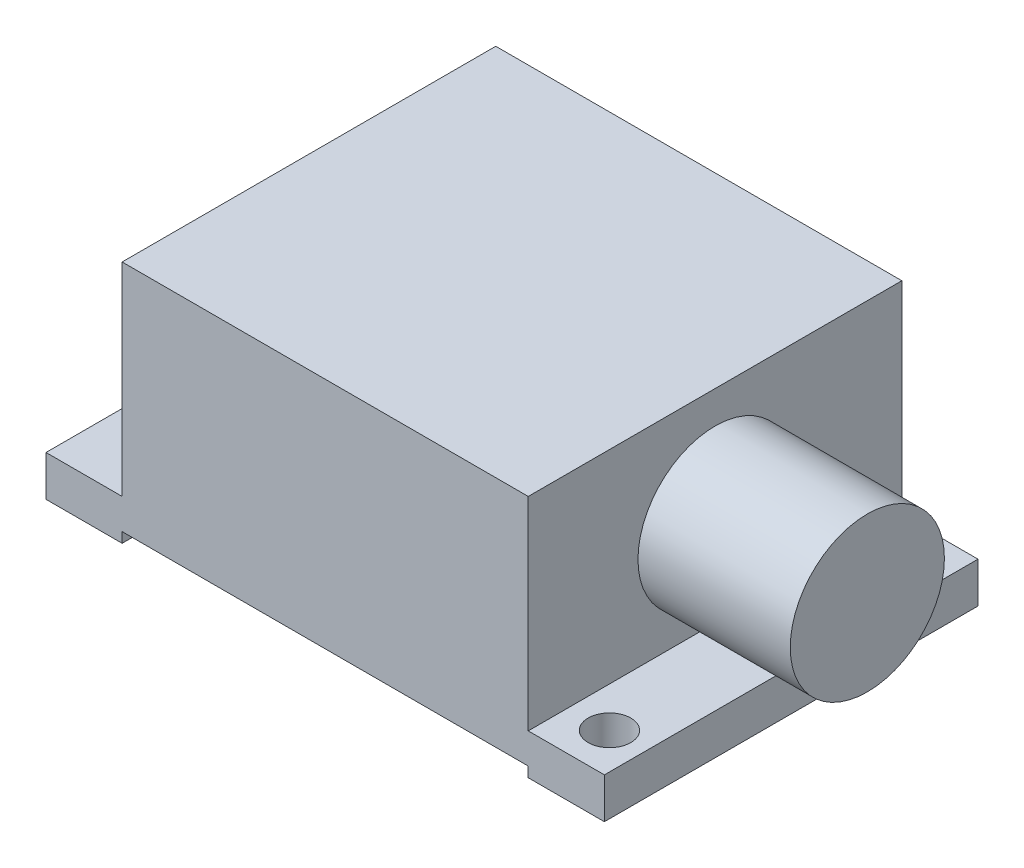
ISO-10303-21;
HEADER;
FILE_DESCRIPTION(('STEP AP214'),'2;1');
FILE_NAME('part.step','',(''),(''),'','','');
FILE_SCHEMA(('AUTOMOTIVE_DESIGN { 1 0 10303 214 1 1 1 1 }'));
ENDSEC;
DATA;
#1=APPLICATION_CONTEXT('core data for automotive mechanical design processes');
#2=APPLICATION_PROTOCOL_DEFINITION('international standard','automotive_design',2000,#1);
#3=PRODUCT_CONTEXT('',#1,'mechanical');
#4=PRODUCT('Part','Part','',(#3));
#5=PRODUCT_RELATED_PRODUCT_CATEGORY('part','',(#4));
#6=PRODUCT_DEFINITION_FORMATION('','',#4);
#7=PRODUCT_DEFINITION_CONTEXT('part definition',#1,'design');
#8=PRODUCT_DEFINITION('design','',#6,#7);
#9=PRODUCT_DEFINITION_SHAPE('','',#8);
#10=(LENGTH_UNIT() NAMED_UNIT(*) SI_UNIT(.MILLI.,.METRE.));
#11=(NAMED_UNIT(*) PLANE_ANGLE_UNIT() SI_UNIT($,.RADIAN.));
#12=(NAMED_UNIT(*) SI_UNIT($,.STERADIAN.) SOLID_ANGLE_UNIT());
#13=UNCERTAINTY_MEASURE_WITH_UNIT(LENGTH_MEASURE(1.E-05),#10,'distance_accuracy_value','');
#14=(GEOMETRIC_REPRESENTATION_CONTEXT(3) GLOBAL_UNCERTAINTY_ASSIGNED_CONTEXT((#13)) GLOBAL_UNIT_ASSIGNED_CONTEXT((#10,
#11,#12)) REPRESENTATION_CONTEXT('',''));
#15=CARTESIAN_POINT('',(0.,0.,0.));
#16=DIRECTION('',(0.,0.,1.));
#17=DIRECTION('',(1.,0.,0.));
#18=AXIS2_PLACEMENT_3D('',#15,#16,#17);
#19=CARTESIAN_POINT('',(0.,0.,0.));
#20=DIRECTION('',(0.,1.,0.));
#21=DIRECTION('',(0.,0.,1.));
#22=AXIS2_PLACEMENT_3D('',#19,#20,#21);
#23=PLANE('',#22);
#24=CARTESIAN_POINT('',(23.95,0.,-14.35));
#25=DIRECTION('',(0.,1.,0.));
#26=DIRECTION('',(0.,0.,1.));
#27=AXIS2_PLACEMENT_3D('',#24,#25,#26);
#28=CIRCLE('',#27,2.1);
#29=CARTESIAN_POINT('',(23.95,0.,-12.25));
#30=VERTEX_POINT('',#29);
#31=EDGE_CURVE('E142',#30,#30,#28,.T.);
#32=ORIENTED_EDGE('',*,*,#31,.T.);
#33=EDGE_LOOP('',(#32));
#34=FACE_BOUND('',#33,.T.);
#35=CARTESIAN_POINT('',(23.95,0.,14.35));
#36=DIRECTION('',(0.,1.,0.));
#37=DIRECTION('',(0.,0.,1.));
#38=AXIS2_PLACEMENT_3D('',#35,#36,#37);
#39=CIRCLE('',#38,2.1);
#40=CARTESIAN_POINT('',(23.95,0.,16.45));
#41=VERTEX_POINT('',#40);
#42=EDGE_CURVE('E221',#41,#41,#39,.T.);
#43=ORIENTED_EDGE('',*,*,#42,.T.);
#44=EDGE_LOOP('',(#43));
#45=FACE_BOUND('',#44,.T.);
#46=DIRECTION('',(1.,0.,0.));
#47=VECTOR('',#46,1.);
#48=CARTESIAN_POINT('',(-27.5,0.,18.4));
#49=LINE('',#48,#47);
#50=CARTESIAN_POINT('',(20.,0.,18.4));
#51=VERTEX_POINT('',#50);
#52=CARTESIAN_POINT('',(27.5,0.,18.4));
#53=VERTEX_POINT('',#52);
#54=EDGE_CURVE('E204',#51,#53,#49,.T.);
#55=ORIENTED_EDGE('',*,*,#54,.F.);
#56=DIRECTION('',(0.,0.,-1.));
#57=VECTOR('',#56,1.);
#58=CARTESIAN_POINT('',(20.,0.,0.));
#59=LINE('',#58,#57);
#60=CARTESIAN_POINT('',(20.,0.,-18.4));
#61=VERTEX_POINT('',#60);
#62=EDGE_CURVE('E43',#51,#61,#59,.T.);
#63=ORIENTED_EDGE('',*,*,#62,.T.);
#64=DIRECTION('',(-1.,0.,0.));
#65=VECTOR('',#64,1.);
#66=CARTESIAN_POINT('',(-27.5,0.,-18.4));
#67=LINE('',#66,#65);
#68=CARTESIAN_POINT('',(27.5,0.,-18.4));
#69=VERTEX_POINT('',#68);
#70=EDGE_CURVE('E199',#69,#61,#67,.T.);
#71=ORIENTED_EDGE('',*,*,#70,.F.);
#72=DIRECTION('',(0.,0.,-1.));
#73=VECTOR('',#72,1.);
#74=CARTESIAN_POINT('',(27.5,0.,-18.4));
#75=LINE('',#74,#73);
#76=EDGE_CURVE('E182',#53,#69,#75,.T.);
#77=ORIENTED_EDGE('',*,*,#76,.F.);
#78=EDGE_LOOP('',(#55,#63,#71,#77));
#79=FACE_BOUND('',#78,.T.);
#80=ADVANCED_FACE('F35',(#34,#45,#79),#23,.F.);
#81=CARTESIAN_POINT('',(0.,4.,0.));
#82=DIRECTION('',(0.,1.,0.));
#83=DIRECTION('',(0.,0.,1.));
#84=AXIS2_PLACEMENT_3D('',#81,#82,#83);
#85=PLANE('',#84);
#86=CARTESIAN_POINT('',(23.95,4.,-14.35));
#87=DIRECTION('',(0.,1.,0.));
#88=DIRECTION('',(0.,0.,1.));
#89=AXIS2_PLACEMENT_3D('',#86,#87,#88);
#90=CIRCLE('',#89,2.1);
#91=CARTESIAN_POINT('',(23.95,4.,-12.25));
#92=VERTEX_POINT('',#91);
#93=EDGE_CURVE('E228',#92,#92,#90,.T.);
#94=ORIENTED_EDGE('',*,*,#93,.F.);
#95=EDGE_LOOP('',(#94));
#96=FACE_BOUND('',#95,.T.);
#97=CARTESIAN_POINT('',(23.95,4.,14.35));
#98=DIRECTION('',(0.,1.,0.));
#99=DIRECTION('',(0.,0.,1.));
#100=AXIS2_PLACEMENT_3D('',#97,#98,#99);
#101=CIRCLE('',#100,2.1);
#102=CARTESIAN_POINT('',(23.95,4.,16.45));
#103=VERTEX_POINT('',#102);
#104=EDGE_CURVE('E233',#103,#103,#101,.T.);
#105=ORIENTED_EDGE('',*,*,#104,.F.);
#106=EDGE_LOOP('',(#105));
#107=FACE_BOUND('',#106,.T.);
#108=DIRECTION('',(0.,0.,-1.));
#109=VECTOR('',#108,1.);
#110=CARTESIAN_POINT('',(20.,4.,-18.4));
#111=LINE('',#110,#109);
#112=CARTESIAN_POINT('',(20.,4.,18.4));
#113=VERTEX_POINT('',#112);
#114=CARTESIAN_POINT('',(20.,4.,-18.4));
#115=VERTEX_POINT('',#114);
#116=EDGE_CURVE('E58',#113,#115,#111,.T.);
#117=ORIENTED_EDGE('',*,*,#116,.F.);
#118=DIRECTION('',(1.,0.,0.));
#119=VECTOR('',#118,1.);
#120=CARTESIAN_POINT('',(-27.5,4.,18.4));
#121=LINE('',#120,#119);
#122=CARTESIAN_POINT('',(27.5,4.,18.4));
#123=VERTEX_POINT('',#122);
#124=EDGE_CURVE('E192',#113,#123,#121,.T.);
#125=ORIENTED_EDGE('',*,*,#124,.T.);
#126=DIRECTION('',(0.,0.,-1.));
#127=VECTOR('',#126,1.);
#128=CARTESIAN_POINT('',(27.5,4.,-18.4));
#129=LINE('',#128,#127);
#130=CARTESIAN_POINT('',(27.5,4.,-18.4));
#131=VERTEX_POINT('',#130);
#132=EDGE_CURVE('E183',#123,#131,#129,.T.);
#133=ORIENTED_EDGE('',*,*,#132,.T.);
#134=DIRECTION('',(-1.,0.,0.));
#135=VECTOR('',#134,1.);
#136=CARTESIAN_POINT('',(-27.5,4.,-18.4));
#137=LINE('',#136,#135);
#138=EDGE_CURVE('E188',#131,#115,#137,.T.);
#139=ORIENTED_EDGE('',*,*,#138,.T.);
#140=EDGE_LOOP('',(#117,#125,#133,#139));
#141=FACE_BOUND('',#140,.T.);
#142=ADVANCED_FACE('F262',(#96,#107,#141),#85,.T.);
#143=CARTESIAN_POINT('',(27.5,4.,-18.4));
#144=DIRECTION('',(-1.,0.,0.));
#145=DIRECTION('',(0.,0.,1.));
#146=AXIS2_PLACEMENT_3D('',#143,#144,#145);
#147=PLANE('',#146);
#148=ORIENTED_EDGE('',*,*,#76,.T.);
#149=DIRECTION('',(0.,-1.,0.));
#150=VECTOR('',#149,1.);
#151=CARTESIAN_POINT('',(27.5,4.,-18.4));
#152=LINE('',#151,#150);
#153=EDGE_CURVE('E214',#131,#69,#152,.T.);
#154=ORIENTED_EDGE('',*,*,#153,.F.);
#155=ORIENTED_EDGE('',*,*,#132,.F.);
#156=DIRECTION('',(0.,-1.,0.));
#157=VECTOR('',#156,1.);
#158=CARTESIAN_POINT('',(27.5,4.,18.4));
#159=LINE('',#158,#157);
#160=EDGE_CURVE('E195',#123,#53,#159,.T.);
#161=ORIENTED_EDGE('',*,*,#160,.T.);
#162=EDGE_LOOP('',(#148,#154,#155,#161));
#163=FACE_BOUND('',#162,.T.);
#164=ADVANCED_FACE('F37',(#163),#147,.F.);
#165=CARTESIAN_POINT('',(-27.5,4.,-18.4));
#166=DIRECTION('',(0.,0.,1.));
#167=DIRECTION('',(1.,0.,0.));
#168=AXIS2_PLACEMENT_3D('',#165,#166,#167);
#169=PLANE('',#168);
#170=ORIENTED_EDGE('',*,*,#70,.T.);
#171=DIRECTION('',(0.,1.,0.));
#172=VECTOR('',#171,1.);
#173=CARTESIAN_POINT('',(20.,4.,-18.4));
#174=LINE('',#173,#172);
#175=CARTESIAN_POINT('',(20.,1.,-18.4));
#176=VERTEX_POINT('',#175);
#177=EDGE_CURVE('E154',#61,#176,#174,.T.);
#178=ORIENTED_EDGE('',*,*,#177,.T.);
#179=DIRECTION('',(-1.,0.,0.));
#180=VECTOR('',#179,1.);
#181=CARTESIAN_POINT('',(-27.5,1.,-18.4));
#182=LINE('',#181,#180);
#183=CARTESIAN_POINT('',(-20.,1.,-18.4));
#184=VERTEX_POINT('',#183);
#185=EDGE_CURVE('E131',#176,#184,#182,.T.);
#186=ORIENTED_EDGE('',*,*,#185,.T.);
#187=DIRECTION('',(0.,-1.,0.));
#188=VECTOR('',#187,1.);
#189=CARTESIAN_POINT('',(-20.,4.,-18.4));
#190=LINE('',#189,#188);
#191=CARTESIAN_POINT('',(-20.,0.,-18.4));
#192=VERTEX_POINT('',#191);
#193=EDGE_CURVE('E150',#184,#192,#190,.T.);
#194=ORIENTED_EDGE('',*,*,#193,.T.);
#195=CARTESIAN_POINT('',(-27.5,0.,-18.4));
#196=VERTEX_POINT('',#195);
#197=EDGE_CURVE('E198',#192,#196,#67,.T.);
#198=ORIENTED_EDGE('',*,*,#197,.T.);
#199=DIRECTION('',(0.,-1.,0.));
#200=VECTOR('',#199,1.);
#201=CARTESIAN_POINT('',(-27.5,4.,-18.4));
#202=LINE('',#201,#200);
#203=CARTESIAN_POINT('',(-27.5,4.,-18.4));
#204=VERTEX_POINT('',#203);
#205=EDGE_CURVE('E211',#204,#196,#202,.T.);
#206=ORIENTED_EDGE('',*,*,#205,.F.);
#207=CARTESIAN_POINT('',(-20.,4.,-18.4));
#208=VERTEX_POINT('',#207);
#209=EDGE_CURVE('E186',#208,#204,#137,.T.);
#210=ORIENTED_EDGE('',*,*,#209,.F.);
#211=DIRECTION('',(0.,-1.,0.));
#212=VECTOR('',#211,1.);
#213=CARTESIAN_POINT('',(-20.,24.,-18.4));
#214=LINE('',#213,#212);
#215=CARTESIAN_POINT('',(-20.,24.,-18.4));
#216=VERTEX_POINT('',#215);
#217=EDGE_CURVE('E176',#216,#208,#214,.T.);
#218=ORIENTED_EDGE('',*,*,#217,.F.);
#219=DIRECTION('',(-1.,0.,0.));
#220=VECTOR('',#219,1.);
#221=CARTESIAN_POINT('',(-20.,24.,-18.4));
#222=LINE('',#221,#220);
#223=CARTESIAN_POINT('',(20.,24.,-18.4));
#224=VERTEX_POINT('',#223);
#225=EDGE_CURVE('E160',#224,#216,#222,.T.);
#226=ORIENTED_EDGE('',*,*,#225,.F.);
#227=DIRECTION('',(0.,-1.,0.));
#228=VECTOR('',#227,1.);
#229=CARTESIAN_POINT('',(20.,24.,-18.4));
#230=LINE('',#229,#228);
#231=EDGE_CURVE('E179',#224,#115,#230,.T.);
#232=ORIENTED_EDGE('',*,*,#231,.T.);
#233=ORIENTED_EDGE('',*,*,#138,.F.);
#234=ORIENTED_EDGE('',*,*,#153,.T.);
#235=EDGE_LOOP('',(#170,#178,#186,#194,#198,#206,#210,#218,#226,#232,#233,#234));
#236=FACE_BOUND('',#235,.T.);
#237=ADVANCED_FACE('F290',(#236),#169,.F.);
#238=CARTESIAN_POINT('',(-27.5,4.,-18.4));
#239=DIRECTION('',(1.,0.,0.));
#240=DIRECTION('',(0.,0.,-1.));
#241=AXIS2_PLACEMENT_3D('',#238,#239,#240);
#242=PLANE('',#241);
#243=DIRECTION('',(0.,0.,1.));
#244=VECTOR('',#243,1.);
#245=CARTESIAN_POINT('',(-27.5,0.,-18.4));
#246=LINE('',#245,#244);
#247=CARTESIAN_POINT('',(-27.5,0.,18.4));
#248=VERTEX_POINT('',#247);
#249=EDGE_CURVE('E202',#196,#248,#246,.T.);
#250=ORIENTED_EDGE('',*,*,#249,.T.);
#251=DIRECTION('',(0.,-1.,0.));
#252=VECTOR('',#251,1.);
#253=CARTESIAN_POINT('',(-27.5,4.,18.4));
#254=LINE('',#253,#252);
#255=CARTESIAN_POINT('',(-27.5,4.,18.4));
#256=VERTEX_POINT('',#255);
#257=EDGE_CURVE('E208',#256,#248,#254,.T.);
#258=ORIENTED_EDGE('',*,*,#257,.F.);
#259=DIRECTION('',(0.,0.,1.));
#260=VECTOR('',#259,1.);
#261=CARTESIAN_POINT('',(-27.5,4.,-18.4));
#262=LINE('',#261,#260);
#263=EDGE_CURVE('E190',#204,#256,#262,.T.);
#264=ORIENTED_EDGE('',*,*,#263,.F.);
#265=ORIENTED_EDGE('',*,*,#205,.T.);
#266=EDGE_LOOP('',(#250,#258,#264,#265));
#267=FACE_BOUND('',#266,.T.);
#268=ADVANCED_FACE('F294',(#267),#242,.F.);
#269=CARTESIAN_POINT('',(-27.5,4.,18.4));
#270=DIRECTION('',(0.,0.,-1.));
#271=DIRECTION('',(-1.,0.,0.));
#272=AXIS2_PLACEMENT_3D('',#269,#270,#271);
#273=PLANE('',#272);
#274=DIRECTION('',(-1.,0.,0.));
#275=VECTOR('',#274,1.);
#276=CARTESIAN_POINT('',(-20.,1.,18.4));
#277=LINE('',#276,#275);
#278=CARTESIAN_POINT('',(20.,1.,18.4));
#279=VERTEX_POINT('',#278);
#280=CARTESIAN_POINT('',(-20.,1.,18.4));
#281=VERTEX_POINT('',#280);
#282=EDGE_CURVE('E129',#279,#281,#277,.T.);
#283=ORIENTED_EDGE('',*,*,#282,.F.);
#284=DIRECTION('',(0.,1.,0.));
#285=VECTOR('',#284,1.);
#286=CARTESIAN_POINT('',(20.,1.,18.4));
#287=LINE('',#286,#285);
#288=EDGE_CURVE('E137',#51,#279,#287,.T.);
#289=ORIENTED_EDGE('',*,*,#288,.F.);
#290=ORIENTED_EDGE('',*,*,#54,.T.);
#291=ORIENTED_EDGE('',*,*,#160,.F.);
#292=ORIENTED_EDGE('',*,*,#124,.F.);
#293=DIRECTION('',(0.,-1.,0.));
#294=VECTOR('',#293,1.);
#295=CARTESIAN_POINT('',(20.,24.,18.4));
#296=LINE('',#295,#294);
#297=CARTESIAN_POINT('',(20.,24.,18.4));
#298=VERTEX_POINT('',#297);
#299=EDGE_CURVE('E167',#298,#113,#296,.T.);
#300=ORIENTED_EDGE('',*,*,#299,.F.);
#301=DIRECTION('',(1.,0.,0.));
#302=VECTOR('',#301,1.);
#303=CARTESIAN_POINT('',(-20.,24.,18.4));
#304=LINE('',#303,#302);
#305=CARTESIAN_POINT('',(-20.,24.,18.4));
#306=VERTEX_POINT('',#305);
#307=EDGE_CURVE('E165',#306,#298,#304,.T.);
#308=ORIENTED_EDGE('',*,*,#307,.F.);
#309=DIRECTION('',(0.,-1.,0.));
#310=VECTOR('',#309,1.);
#311=CARTESIAN_POINT('',(-20.,24.,18.4));
#312=LINE('',#311,#310);
#313=CARTESIAN_POINT('',(-20.,4.,18.4));
#314=VERTEX_POINT('',#313);
#315=EDGE_CURVE('E173',#306,#314,#312,.T.);
#316=ORIENTED_EDGE('',*,*,#315,.T.);
#317=EDGE_CURVE('E193',#256,#314,#121,.T.);
#318=ORIENTED_EDGE('',*,*,#317,.F.);
#319=ORIENTED_EDGE('',*,*,#257,.T.);
#320=CARTESIAN_POINT('',(-20.,0.,18.4));
#321=VERTEX_POINT('',#320);
#322=EDGE_CURVE('E187',#248,#321,#49,.T.);
#323=ORIENTED_EDGE('',*,*,#322,.T.);
#324=DIRECTION('',(0.,-1.,0.));
#325=VECTOR('',#324,1.);
#326=CARTESIAN_POINT('',(-20.,1.,18.4));
#327=LINE('',#326,#325);
#328=EDGE_CURVE('E50',#281,#321,#327,.T.);
#329=ORIENTED_EDGE('',*,*,#328,.F.);
#330=EDGE_LOOP('',(#283,#289,#290,#291,#292,#300,#308,#316,#318,#319,#323,#329));
#331=FACE_BOUND('',#330,.T.);
#332=ADVANCED_FACE('F144',(#331),#273,.F.);
#333=CARTESIAN_POINT('',(-23.95,4.,0.));
#334=DIRECTION('',(0.,1.,0.));
#335=DIRECTION('',(0.,0.,1.));
#336=AXIS2_PLACEMENT_3D('',#333,#334,#335);
#337=CIRCLE('',#336,2.1);
#338=CARTESIAN_POINT('',(-23.95,4.,2.1));
#339=VERTEX_POINT('',#338);
#340=EDGE_CURVE('E222',#339,#339,#337,.T.);
#341=ORIENTED_EDGE('',*,*,#340,.F.);
#342=EDGE_LOOP('',(#341));
#343=FACE_BOUND('',#342,.T.);
#344=DIRECTION('',(0.,0.,1.));
#345=VECTOR('',#344,1.);
#346=CARTESIAN_POINT('',(-20.,4.,-18.4));
#347=LINE('',#346,#345);
#348=EDGE_CURVE('E161',#208,#314,#347,.T.);
#349=ORIENTED_EDGE('',*,*,#348,.F.);
#350=ORIENTED_EDGE('',*,*,#209,.T.);
#351=ORIENTED_EDGE('',*,*,#263,.T.);
#352=ORIENTED_EDGE('',*,*,#317,.T.);
#353=EDGE_LOOP('',(#349,#350,#351,#352));
#354=FACE_BOUND('',#353,.T.);
#355=ADVANCED_FACE('F271',(#343,#354),#85,.T.);
#356=CARTESIAN_POINT('',(-23.95,0.,0.));
#357=DIRECTION('',(0.,1.,0.));
#358=DIRECTION('',(0.,0.,1.));
#359=AXIS2_PLACEMENT_3D('',#356,#357,#358);
#360=CIRCLE('',#359,2.1);
#361=CARTESIAN_POINT('',(-23.95,0.,2.1));
#362=VERTEX_POINT('',#361);
#363=EDGE_CURVE('E219',#362,#362,#360,.T.);
#364=ORIENTED_EDGE('',*,*,#363,.T.);
#365=EDGE_LOOP('',(#364));
#366=FACE_BOUND('',#365,.T.);
#367=ORIENTED_EDGE('',*,*,#197,.F.);
#368=DIRECTION('',(0.,0.,1.));
#369=VECTOR('',#368,1.);
#370=CARTESIAN_POINT('',(-20.,0.,0.));
#371=LINE('',#370,#369);
#372=EDGE_CURVE('E217',#192,#321,#371,.T.);
#373=ORIENTED_EDGE('',*,*,#372,.T.);
#374=ORIENTED_EDGE('',*,*,#322,.F.);
#375=ORIENTED_EDGE('',*,*,#249,.F.);
#376=EDGE_LOOP('',(#367,#373,#374,#375));
#377=FACE_BOUND('',#376,.T.);
#378=ADVANCED_FACE('F264',(#366,#377),#23,.F.);
#379=CARTESIAN_POINT('',(20.,24.,-18.4));
#380=DIRECTION('',(-1.,0.,0.));
#381=DIRECTION('',(0.,0.,1.));
#382=AXIS2_PLACEMENT_3D('',#379,#380,#381);
#383=PLANE('',#382);
#384=CARTESIAN_POINT('',(20.,13.2144229165557,0.));
#385=DIRECTION('',(-1.,0.,0.));
#386=DIRECTION('',(0.,0.,1.));
#387=AXIS2_PLACEMENT_3D('',#384,#385,#386);
#388=CIRCLE('',#387,7.5918553590423);
#389=CARTESIAN_POINT('',(20.,13.2144229165557,7.5918553590423));
#390=VERTEX_POINT('',#389);
#391=EDGE_CURVE('E11',#390,#390,#388,.F.);
#392=ORIENTED_EDGE('',*,*,#391,.F.);
#393=EDGE_LOOP('',(#392));
#394=FACE_BOUND('',#393,.T.);
#395=ORIENTED_EDGE('',*,*,#116,.T.);
#396=ORIENTED_EDGE('',*,*,#231,.F.);
#397=DIRECTION('',(0.,0.,-1.));
#398=VECTOR('',#397,1.);
#399=CARTESIAN_POINT('',(20.,24.,-18.4));
#400=LINE('',#399,#398);
#401=EDGE_CURVE('E157',#298,#224,#400,.T.);
#402=ORIENTED_EDGE('',*,*,#401,.F.);
#403=ORIENTED_EDGE('',*,*,#299,.T.);
#404=EDGE_LOOP('',(#395,#396,#402,#403));
#405=FACE_BOUND('',#404,.T.);
#406=ADVANCED_FACE('F274',(#394,#405),#383,.F.);
#407=CARTESIAN_POINT('',(-20.,24.,-18.4));
#408=DIRECTION('',(1.,0.,0.));
#409=DIRECTION('',(0.,0.,-1.));
#410=AXIS2_PLACEMENT_3D('',#407,#408,#409);
#411=PLANE('',#410);
#412=ORIENTED_EDGE('',*,*,#348,.T.);
#413=ORIENTED_EDGE('',*,*,#315,.F.);
#414=DIRECTION('',(0.,0.,1.));
#415=VECTOR('',#414,1.);
#416=CARTESIAN_POINT('',(-20.,24.,-18.4));
#417=LINE('',#416,#415);
#418=EDGE_CURVE('E163',#216,#306,#417,.T.);
#419=ORIENTED_EDGE('',*,*,#418,.F.);
#420=ORIENTED_EDGE('',*,*,#217,.T.);
#421=EDGE_LOOP('',(#412,#413,#419,#420));
#422=FACE_BOUND('',#421,.T.);
#423=ADVANCED_FACE('F280',(#422),#411,.F.);
#424=CARTESIAN_POINT('',(0.,24.,0.));
#425=DIRECTION('',(0.,1.,0.));
#426=DIRECTION('',(0.,0.,1.));
#427=AXIS2_PLACEMENT_3D('',#424,#425,#426);
#428=PLANE('',#427);
#429=ORIENTED_EDGE('',*,*,#401,.T.);
#430=ORIENTED_EDGE('',*,*,#225,.T.);
#431=ORIENTED_EDGE('',*,*,#418,.T.);
#432=ORIENTED_EDGE('',*,*,#307,.T.);
#433=EDGE_LOOP('',(#429,#430,#431,#432));
#434=FACE_BOUND('',#433,.T.);
#435=ADVANCED_FACE('F304',(#434),#428,.T.);
#436=CARTESIAN_POINT('',(-20.,1.,-181.6));
#437=DIRECTION('',(0.,1.,0.));
#438=DIRECTION('',(0.,0.,1.));
#439=AXIS2_PLACEMENT_3D('',#436,#437,#438);
#440=PLANE('',#439);
#441=DIRECTION('',(0.,0.,1.));
#442=VECTOR('',#441,1.);
#443=CARTESIAN_POINT('',(20.,1.,-181.6));
#444=LINE('',#443,#442);
#445=EDGE_CURVE('E124',#176,#279,#444,.T.);
#446=ORIENTED_EDGE('',*,*,#445,.T.);
#447=ORIENTED_EDGE('',*,*,#282,.T.);
#448=DIRECTION('',(0.,0.,1.));
#449=VECTOR('',#448,1.);
#450=CARTESIAN_POINT('',(-20.,1.,-181.6));
#451=LINE('',#450,#449);
#452=EDGE_CURVE('E134',#184,#281,#451,.T.);
#453=ORIENTED_EDGE('',*,*,#452,.F.);
#454=ORIENTED_EDGE('',*,*,#185,.F.);
#455=EDGE_LOOP('',(#446,#447,#453,#454));
#456=FACE_BOUND('',#455,.T.);
#457=ADVANCED_FACE('F126',(#456),#440,.F.);
#458=CARTESIAN_POINT('',(20.,1.,-181.6));
#459=DIRECTION('',(1.,0.,0.));
#460=DIRECTION('',(0.,0.,-1.));
#461=AXIS2_PLACEMENT_3D('',#458,#459,#460);
#462=PLANE('',#461);
#463=ORIENTED_EDGE('',*,*,#62,.F.);
#464=ORIENTED_EDGE('',*,*,#288,.T.);
#465=ORIENTED_EDGE('',*,*,#445,.F.);
#466=ORIENTED_EDGE('',*,*,#177,.F.);
#467=EDGE_LOOP('',(#463,#464,#465,#466));
#468=FACE_BOUND('',#467,.T.);
#469=ADVANCED_FACE('F138',(#468),#462,.F.);
#470=CARTESIAN_POINT('',(-20.,1.,-181.6));
#471=DIRECTION('',(-1.,0.,0.));
#472=DIRECTION('',(0.,0.,1.));
#473=AXIS2_PLACEMENT_3D('',#470,#471,#472);
#474=PLANE('',#473);
#475=ORIENTED_EDGE('',*,*,#452,.T.);
#476=ORIENTED_EDGE('',*,*,#328,.T.);
#477=ORIENTED_EDGE('',*,*,#372,.F.);
#478=ORIENTED_EDGE('',*,*,#193,.F.);
#479=EDGE_LOOP('',(#475,#476,#477,#478));
#480=FACE_BOUND('',#479,.T.);
#481=ADVANCED_FACE('F372',(#480),#474,.F.);
#482=CARTESIAN_POINT('',(-23.95,-196.,0.));
#483=DIRECTION('',(0.,1.,0.));
#484=DIRECTION('',(0.,0.,1.));
#485=AXIS2_PLACEMENT_3D('',#482,#483,#484);
#486=CYLINDRICAL_SURFACE('',#485,2.1);
#487=ORIENTED_EDGE('',*,*,#340,.T.);
#488=EDGE_LOOP('',(#487));
#489=FACE_BOUND('',#488,.T.);
#490=ORIENTED_EDGE('',*,*,#363,.F.);
#491=EDGE_LOOP('',(#490));
#492=FACE_BOUND('',#491,.T.);
#493=ADVANCED_FACE('F257',(#489,#492),#486,.F.);
#494=CARTESIAN_POINT('',(23.95,-196.,14.35));
#495=DIRECTION('',(0.,1.,0.));
#496=DIRECTION('',(0.,0.,1.));
#497=AXIS2_PLACEMENT_3D('',#494,#495,#496);
#498=CYLINDRICAL_SURFACE('',#497,2.1);
#499=ORIENTED_EDGE('',*,*,#104,.T.);
#500=EDGE_LOOP('',(#499));
#501=FACE_BOUND('',#500,.T.);
#502=ORIENTED_EDGE('',*,*,#42,.F.);
#503=EDGE_LOOP('',(#502));
#504=FACE_BOUND('',#503,.T.);
#505=ADVANCED_FACE('F247',(#501,#504),#498,.F.);
#506=CARTESIAN_POINT('',(23.95,-196.,-14.35));
#507=DIRECTION('',(0.,1.,0.));
#508=DIRECTION('',(0.,0.,1.));
#509=AXIS2_PLACEMENT_3D('',#506,#507,#508);
#510=CYLINDRICAL_SURFACE('',#509,2.1);
#511=ORIENTED_EDGE('',*,*,#93,.T.);
#512=EDGE_LOOP('',(#511));
#513=FACE_BOUND('',#512,.T.);
#514=ORIENTED_EDGE('',*,*,#31,.F.);
#515=EDGE_LOOP('',(#514));
#516=FACE_BOUND('',#515,.T.);
#517=ADVANCED_FACE('F244',(#513,#516),#510,.F.);
#518=CARTESIAN_POINT('',(35.,13.2144229165557,0.));
#519=DIRECTION('',(-1.,0.,0.));
#520=DIRECTION('',(0.,0.,1.));
#521=AXIS2_PLACEMENT_3D('',#518,#519,#520);
#522=CYLINDRICAL_SURFACE('',#521,7.5918553590423);
#523=CARTESIAN_POINT('',(35.,13.2144229165557,0.));
#524=DIRECTION('',(1.,0.,0.));
#525=DIRECTION('',(0.,0.,-1.));
#526=AXIS2_PLACEMENT_3D('',#523,#524,#525);
#527=CIRCLE('',#526,7.5918553590423);
#528=CARTESIAN_POINT('',(35.,13.2144229165557,-7.5918553590423));
#529=VERTEX_POINT('',#528);
#530=EDGE_CURVE('E236',#529,#529,#527,.T.);
#531=ORIENTED_EDGE('',*,*,#530,.F.);
#532=EDGE_LOOP('',(#531));
#533=FACE_BOUND('',#532,.T.);
#534=ORIENTED_EDGE('',*,*,#391,.T.);
#535=EDGE_LOOP('',(#534));
#536=FACE_BOUND('',#535,.T.);
#537=ADVANCED_FACE('F246',(#533,#536),#522,.T.);
#538=CARTESIAN_POINT('',(35.,13.2144229165557,0.));
#539=DIRECTION('',(1.,0.,0.));
#540=DIRECTION('',(0.,0.,-1.));
#541=AXIS2_PLACEMENT_3D('',#538,#539,#540);
#542=PLANE('',#541);
#543=ORIENTED_EDGE('',*,*,#530,.T.);
#544=EDGE_LOOP('',(#543));
#545=FACE_BOUND('',#544,.T.);
#546=ADVANCED_FACE('F254',(#545),#542,.T.);
#547=CLOSED_SHELL('',(#80,#142,#164,#237,#268,#332,#355,#378,#406,#423,#435,#457,#469,#481,#493,
#505,#517,#537,#546));
#548=MANIFOLD_SOLID_BREP('B2',#547);
#549=ADVANCED_BREP_SHAPE_REPRESENTATION('',(#18,#548),#14);
#550=SHAPE_DEFINITION_REPRESENTATION(#9,#549);
ENDSEC;
END-ISO-10303-21;
